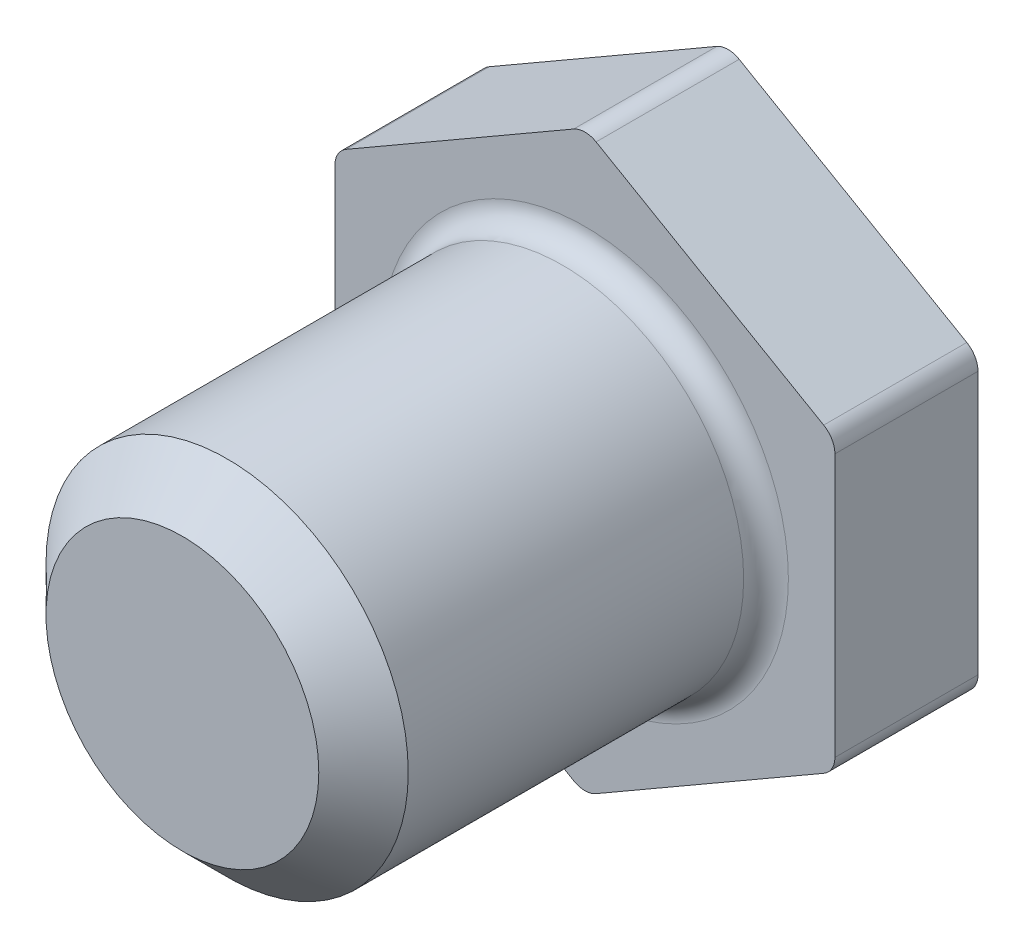
ISO-10303-21;
HEADER;
FILE_DESCRIPTION(('STEP AP214'),'2;1');
FILE_NAME('part.step','',(''),(''),'','','');
FILE_SCHEMA(('AUTOMOTIVE_DESIGN { 1 0 10303 214 1 1 1 1 }'));
ENDSEC;
DATA;
#1=APPLICATION_CONTEXT('core data for automotive mechanical design processes');
#2=APPLICATION_PROTOCOL_DEFINITION('international standard','automotive_design',2000,#1);
#3=PRODUCT_CONTEXT('',#1,'mechanical');
#4=PRODUCT('Part','Part','',(#3));
#5=PRODUCT_RELATED_PRODUCT_CATEGORY('part','',(#4));
#6=PRODUCT_DEFINITION_FORMATION('','',#4);
#7=PRODUCT_DEFINITION_CONTEXT('part definition',#1,'design');
#8=PRODUCT_DEFINITION('design','',#6,#7);
#9=PRODUCT_DEFINITION_SHAPE('','',#8);
#10=(LENGTH_UNIT() NAMED_UNIT(*) SI_UNIT(.MILLI.,.METRE.));
#11=(NAMED_UNIT(*) PLANE_ANGLE_UNIT() SI_UNIT($,.RADIAN.));
#12=(NAMED_UNIT(*) SI_UNIT($,.STERADIAN.) SOLID_ANGLE_UNIT());
#13=UNCERTAINTY_MEASURE_WITH_UNIT(LENGTH_MEASURE(1.E-05),#10,'distance_accuracy_value','');
#14=(GEOMETRIC_REPRESENTATION_CONTEXT(3) GLOBAL_UNCERTAINTY_ASSIGNED_CONTEXT((#13)) GLOBAL_UNIT_ASSIGNED_CONTEXT((#10,
#11,#12)) REPRESENTATION_CONTEXT('',''));
#15=CARTESIAN_POINT('',(0.,0.,0.));
#16=DIRECTION('',(0.,0.,1.));
#17=DIRECTION('',(1.,0.,0.));
#18=AXIS2_PLACEMENT_3D('',#15,#16,#17);
#19=CARTESIAN_POINT('',(5.59,-3.22738800477001,3.2));
#20=DIRECTION('',(-1.,0.,0.));
#21=DIRECTION('',(0.,-1.,0.));
#22=AXIS2_PLACEMENT_3D('',#19,#20,#21);
#23=PLANE('',#22);
#24=DIRECTION('',(0.,1.,0.));
#25=VECTOR('',#24,1.);
#26=CARTESIAN_POINT('',(5.59,-3.22738800477001,3.2));
#27=LINE('',#26,#25);
#28=CARTESIAN_POINT('',(5.59,-2.9387128701752,3.2));
#29=VERTEX_POINT('',#28);
#30=CARTESIAN_POINT('',(5.59,2.93871287017519,3.2));
#31=VERTEX_POINT('',#30);
#32=EDGE_CURVE('E145',#29,#31,#27,.T.);
#33=ORIENTED_EDGE('',*,*,#32,.F.);
#34=DIRECTION('',(0.,0.,-1.));
#35=VECTOR('',#34,1.);
#36=CARTESIAN_POINT('',(5.59,-2.9387128701752,3.2));
#37=LINE('',#36,#35);
#38=CARTESIAN_POINT('',(5.59,-2.9387128701752,0.));
#39=VERTEX_POINT('',#38);
#40=EDGE_CURVE('E159',#29,#39,#37,.T.);
#41=ORIENTED_EDGE('',*,*,#40,.T.);
#42=DIRECTION('',(0.,1.,0.));
#43=VECTOR('',#42,1.);
#44=CARTESIAN_POINT('',(5.59,-3.22738800477001,0.));
#45=LINE('',#44,#43);
#46=CARTESIAN_POINT('',(5.59,2.93871287017519,0.));
#47=VERTEX_POINT('',#46);
#48=EDGE_CURVE('E320',#39,#47,#45,.T.);
#49=ORIENTED_EDGE('',*,*,#48,.T.);
#50=DIRECTION('',(0.,0.,-1.));
#51=VECTOR('',#50,1.);
#52=CARTESIAN_POINT('',(5.59,2.93871287017519,3.2));
#53=LINE('',#52,#51);
#54=EDGE_CURVE('E161',#47,#31,#53,.F.);
#55=ORIENTED_EDGE('',*,*,#54,.T.);
#56=EDGE_LOOP('',(#33,#41,#49,#55));
#57=FACE_BOUND('',#56,.T.);
#58=ADVANCED_FACE('F47',(#57),#23,.F.);
#59=CARTESIAN_POINT('',(5.59,3.22738800477001,3.2));
#60=DIRECTION('',(-0.5,-0.866025403784439,0.));
#61=DIRECTION('',(0.866025403784439,-0.5,0.));
#62=AXIS2_PLACEMENT_3D('',#59,#60,#61);
#63=PLANE('',#62);
#64=DIRECTION('',(-0.866025403784439,0.5,0.));
#65=VECTOR('',#64,1.);
#66=CARTESIAN_POINT('',(5.59,3.22738800477001,3.2));
#67=LINE('',#66,#65);
#68=CARTESIAN_POINT('',(5.34,3.37172557206741,3.2));
#69=VERTEX_POINT('',#68);
#70=CARTESIAN_POINT('',(0.249999999999999,6.31043844224261,3.2));
#71=VERTEX_POINT('',#70);
#72=EDGE_CURVE('E163',#69,#71,#67,.T.);
#73=ORIENTED_EDGE('',*,*,#72,.F.);
#74=DIRECTION('',(0.,0.,-1.));
#75=VECTOR('',#74,1.);
#76=CARTESIAN_POINT('',(5.34,3.37172557206741,3.2));
#77=LINE('',#76,#75);
#78=CARTESIAN_POINT('',(5.34,3.37172557206741,0.));
#79=VERTEX_POINT('',#78);
#80=EDGE_CURVE('E173',#69,#79,#77,.T.);
#81=ORIENTED_EDGE('',*,*,#80,.T.);
#82=DIRECTION('',(-0.866025403784439,0.5,0.));
#83=VECTOR('',#82,1.);
#84=CARTESIAN_POINT('',(5.59,3.22738800477001,0.));
#85=LINE('',#84,#83);
#86=CARTESIAN_POINT('',(0.249999999999999,6.31043844224261,0.));
#87=VERTEX_POINT('',#86);
#88=EDGE_CURVE('E323',#79,#87,#85,.T.);
#89=ORIENTED_EDGE('',*,*,#88,.T.);
#90=DIRECTION('',(0.,0.,-1.));
#91=VECTOR('',#90,1.);
#92=CARTESIAN_POINT('',(0.25,6.31043844224261,3.2));
#93=LINE('',#92,#91);
#94=EDGE_CURVE('E169',#87,#71,#93,.F.);
#95=ORIENTED_EDGE('',*,*,#94,.T.);
#96=EDGE_LOOP('',(#73,#81,#89,#95));
#97=FACE_BOUND('',#96,.T.);
#98=ADVANCED_FACE('F197',(#97),#63,.F.);
#99=CARTESIAN_POINT('',(0.,6.45477600954001,3.2));
#100=DIRECTION('',(0.499999999999999,-0.866025403784439,0.));
#101=DIRECTION('',(0.866025403784439,0.499999999999999,0.));
#102=AXIS2_PLACEMENT_3D('',#99,#100,#101);
#103=PLANE('',#102);
#104=DIRECTION('',(-0.866025403784439,-0.499999999999999,0.));
#105=VECTOR('',#104,1.);
#106=CARTESIAN_POINT('',(0.,6.45477600954001,0.));
#107=LINE('',#106,#105);
#108=CARTESIAN_POINT('',(-0.25,6.31043844224261,0.));
#109=VERTEX_POINT('',#108);
#110=CARTESIAN_POINT('',(-5.34,3.37172557206742,0.));
#111=VERTEX_POINT('',#110);
#112=EDGE_CURVE('E326',#109,#111,#107,.T.);
#113=ORIENTED_EDGE('',*,*,#112,.T.);
#114=DIRECTION('',(0.,0.,-1.));
#115=VECTOR('',#114,1.);
#116=CARTESIAN_POINT('',(-5.34,3.37172557206742,3.2));
#117=LINE('',#116,#115);
#118=CARTESIAN_POINT('',(-5.34,3.37172557206742,3.2));
#119=VERTEX_POINT('',#118);
#120=EDGE_CURVE('E276',#111,#119,#117,.F.);
#121=ORIENTED_EDGE('',*,*,#120,.T.);
#122=DIRECTION('',(-0.866025403784439,-0.499999999999999,0.));
#123=VECTOR('',#122,1.);
#124=CARTESIAN_POINT('',(0.,6.45477600954001,3.2));
#125=LINE('',#124,#123);
#126=CARTESIAN_POINT('',(-0.25,6.31043844224261,3.2));
#127=VERTEX_POINT('',#126);
#128=EDGE_CURVE('E360',#127,#119,#125,.T.);
#129=ORIENTED_EDGE('',*,*,#128,.F.);
#130=DIRECTION('',(0.,0.,-1.));
#131=VECTOR('',#130,1.);
#132=CARTESIAN_POINT('',(-0.25,6.31043844224261,3.2));
#133=LINE('',#132,#131);
#134=EDGE_CURVE('E272',#127,#109,#133,.T.);
#135=ORIENTED_EDGE('',*,*,#134,.T.);
#136=EDGE_LOOP('',(#113,#121,#129,#135));
#137=FACE_BOUND('',#136,.T.);
#138=ADVANCED_FACE('F202',(#137),#103,.F.);
#139=CARTESIAN_POINT('',(-5.59,3.22738800477001,3.2));
#140=DIRECTION('',(1.,0.,0.));
#141=DIRECTION('',(0.,1.,0.));
#142=AXIS2_PLACEMENT_3D('',#139,#140,#141);
#143=PLANE('',#142);
#144=DIRECTION('',(0.,-1.,0.));
#145=VECTOR('',#144,1.);
#146=CARTESIAN_POINT('',(-5.59,3.22738800477001,3.2));
#147=LINE('',#146,#145);
#148=CARTESIAN_POINT('',(-5.59,2.9387128701752,3.2));
#149=VERTEX_POINT('',#148);
#150=CARTESIAN_POINT('',(-5.59,-2.9387128701752,3.2));
#151=VERTEX_POINT('',#150);
#152=EDGE_CURVE('E316',#149,#151,#147,.T.);
#153=ORIENTED_EDGE('',*,*,#152,.F.);
#154=DIRECTION('',(0.,0.,-1.));
#155=VECTOR('',#154,1.);
#156=CARTESIAN_POINT('',(-5.59,2.9387128701752,3.2));
#157=LINE('',#156,#155);
#158=CARTESIAN_POINT('',(-5.59,2.9387128701752,0.));
#159=VERTEX_POINT('',#158);
#160=EDGE_CURVE('E253',#149,#159,#157,.T.);
#161=ORIENTED_EDGE('',*,*,#160,.T.);
#162=DIRECTION('',(0.,-1.,0.));
#163=VECTOR('',#162,1.);
#164=CARTESIAN_POINT('',(-5.59,3.22738800477001,0.));
#165=LINE('',#164,#163);
#166=CARTESIAN_POINT('',(-5.59,-2.9387128701752,0.));
#167=VERTEX_POINT('',#166);
#168=EDGE_CURVE('E304',#159,#167,#165,.T.);
#169=ORIENTED_EDGE('',*,*,#168,.T.);
#170=DIRECTION('',(0.,0.,-1.));
#171=VECTOR('',#170,1.);
#172=CARTESIAN_POINT('',(-5.59,-2.9387128701752,3.2));
#173=LINE('',#172,#171);
#174=EDGE_CURVE('E250',#167,#151,#173,.F.);
#175=ORIENTED_EDGE('',*,*,#174,.T.);
#176=EDGE_LOOP('',(#153,#161,#169,#175));
#177=FACE_BOUND('',#176,.T.);
#178=ADVANCED_FACE('F334',(#177),#143,.F.);
#179=CARTESIAN_POINT('',(-5.59,-3.22738800477001,3.2));
#180=DIRECTION('',(0.5,0.866025403784439,0.));
#181=DIRECTION('',(-0.866025403784439,0.5,0.));
#182=AXIS2_PLACEMENT_3D('',#179,#180,#181);
#183=PLANE('',#182);
#184=DIRECTION('',(0.866025403784439,-0.5,0.));
#185=VECTOR('',#184,1.);
#186=CARTESIAN_POINT('',(-5.59,-3.22738800477001,3.2));
#187=LINE('',#186,#185);
#188=CARTESIAN_POINT('',(-5.34,-3.37172557206741,3.2));
#189=VERTEX_POINT('',#188);
#190=CARTESIAN_POINT('',(-0.250000000000003,-6.31043844224261,3.2));
#191=VERTEX_POINT('',#190);
#192=EDGE_CURVE('E312',#189,#191,#187,.T.);
#193=ORIENTED_EDGE('',*,*,#192,.F.);
#194=DIRECTION('',(0.,0.,-1.));
#195=VECTOR('',#194,1.);
#196=CARTESIAN_POINT('',(-5.34,-3.37172557206741,3.2));
#197=LINE('',#196,#195);
#198=CARTESIAN_POINT('',(-5.34,-3.37172557206741,0.));
#199=VERTEX_POINT('',#198);
#200=EDGE_CURVE('E282',#189,#199,#197,.T.);
#201=ORIENTED_EDGE('',*,*,#200,.T.);
#202=DIRECTION('',(0.866025403784439,-0.5,0.));
#203=VECTOR('',#202,1.);
#204=CARTESIAN_POINT('',(-5.59,-3.22738800477001,0.));
#205=LINE('',#204,#203);
#206=CARTESIAN_POINT('',(-0.250000000000003,-6.31043844224261,0.));
#207=VERTEX_POINT('',#206);
#208=EDGE_CURVE('E301',#199,#207,#205,.T.);
#209=ORIENTED_EDGE('',*,*,#208,.T.);
#210=DIRECTION('',(0.,0.,-1.));
#211=VECTOR('',#210,1.);
#212=CARTESIAN_POINT('',(-0.250000000000003,-6.31043844224261,3.2));
#213=LINE('',#212,#211);
#214=EDGE_CURVE('E279',#207,#191,#213,.F.);
#215=ORIENTED_EDGE('',*,*,#214,.T.);
#216=EDGE_LOOP('',(#193,#201,#209,#215));
#217=FACE_BOUND('',#216,.T.);
#218=ADVANCED_FACE('F341',(#217),#183,.F.);
#219=CARTESIAN_POINT('',(0.,-6.45477600954001,3.2));
#220=DIRECTION('',(-0.499999999999999,0.866025403784439,0.));
#221=DIRECTION('',(-0.866025403784439,-0.499999999999999,0.));
#222=AXIS2_PLACEMENT_3D('',#219,#220,#221);
#223=PLANE('',#222);
#224=DIRECTION('',(0.866025403784439,0.499999999999999,0.));
#225=VECTOR('',#224,1.);
#226=CARTESIAN_POINT('',(0.,-6.45477600954001,3.2));
#227=LINE('',#226,#225);
#228=CARTESIAN_POINT('',(0.249999999999996,-6.31043844224261,3.2));
#229=VERTEX_POINT('',#228);
#230=CARTESIAN_POINT('',(5.34,-3.37172557206742,3.2));
#231=VERTEX_POINT('',#230);
#232=EDGE_CURVE('E148',#229,#231,#227,.T.);
#233=ORIENTED_EDGE('',*,*,#232,.F.);
#234=DIRECTION('',(0.,0.,-1.));
#235=VECTOR('',#234,1.);
#236=CARTESIAN_POINT('',(0.249999999999996,-6.31043844224261,3.2));
#237=LINE('',#236,#235);
#238=CARTESIAN_POINT('',(0.249999999999996,-6.31043844224261,0.));
#239=VERTEX_POINT('',#238);
#240=EDGE_CURVE('E175',#229,#239,#237,.T.);
#241=ORIENTED_EDGE('',*,*,#240,.T.);
#242=DIRECTION('',(0.866025403784439,0.499999999999999,0.));
#243=VECTOR('',#242,1.);
#244=CARTESIAN_POINT('',(0.,-6.45477600954001,0.));
#245=LINE('',#244,#243);
#246=CARTESIAN_POINT('',(5.34,-3.37172557206742,0.));
#247=VERTEX_POINT('',#246);
#248=EDGE_CURVE('E164',#239,#247,#245,.T.);
#249=ORIENTED_EDGE('',*,*,#248,.T.);
#250=DIRECTION('',(0.,0.,-1.));
#251=VECTOR('',#250,1.);
#252=CARTESIAN_POINT('',(5.34,-3.37172557206742,3.2));
#253=LINE('',#252,#251);
#254=EDGE_CURVE('E286',#247,#231,#253,.F.);
#255=ORIENTED_EDGE('',*,*,#254,.T.);
#256=EDGE_LOOP('',(#233,#241,#249,#255));
#257=FACE_BOUND('',#256,.T.);
#258=ADVANCED_FACE('F294',(#257),#223,.F.);
#259=CARTESIAN_POINT('',(0.,0.,3.2));
#260=DIRECTION('',(0.,0.,1.));
#261=DIRECTION('',(1.,0.,0.));
#262=AXIS2_PLACEMENT_3D('',#259,#260,#261);
#263=PLANE('',#262);
#264=CARTESIAN_POINT('',(0.,0.,3.2));
#265=DIRECTION('',(0.,0.,1.));
#266=DIRECTION('',(1.,0.,0.));
#267=AXIS2_PLACEMENT_3D('',#264,#265,#266);
#268=CIRCLE('',#267,4.55);
#269=CARTESIAN_POINT('',(4.55,0.,3.2));
#270=VERTEX_POINT('',#269);
#271=EDGE_CURVE('E246',#270,#270,#268,.F.);
#272=ORIENTED_EDGE('',*,*,#271,.T.);
#273=EDGE_LOOP('',(#272));
#274=FACE_BOUND('',#273,.T.);
#275=ORIENTED_EDGE('',*,*,#128,.T.);
#276=CARTESIAN_POINT('',(-5.09,2.9387128701752,3.2));
#277=DIRECTION('',(0.,0.,1.));
#278=DIRECTION('',(1.,0.,0.));
#279=AXIS2_PLACEMENT_3D('',#276,#277,#278);
#280=CIRCLE('',#279,0.5);
#281=EDGE_CURVE('E243',#119,#149,#280,.T.);
#282=ORIENTED_EDGE('',*,*,#281,.T.);
#283=ORIENTED_EDGE('',*,*,#152,.T.);
#284=CARTESIAN_POINT('',(-5.09,-2.9387128701752,3.2));
#285=DIRECTION('',(0.,0.,1.));
#286=DIRECTION('',(1.,0.,0.));
#287=AXIS2_PLACEMENT_3D('',#284,#285,#286);
#288=CIRCLE('',#287,0.5);
#289=EDGE_CURVE('E240',#151,#189,#288,.T.);
#290=ORIENTED_EDGE('',*,*,#289,.T.);
#291=ORIENTED_EDGE('',*,*,#192,.T.);
#292=CARTESIAN_POINT('',(0.,-5.87742574035039,3.2));
#293=DIRECTION('',(0.,0.,1.));
#294=DIRECTION('',(1.,0.,0.));
#295=AXIS2_PLACEMENT_3D('',#292,#293,#294);
#296=CIRCLE('',#295,0.5);
#297=EDGE_CURVE('E153',#191,#229,#296,.T.);
#298=ORIENTED_EDGE('',*,*,#297,.T.);
#299=ORIENTED_EDGE('',*,*,#232,.T.);
#300=CARTESIAN_POINT('',(5.09,-2.9387128701752,3.2));
#301=DIRECTION('',(0.,0.,1.));
#302=DIRECTION('',(1.,0.,0.));
#303=AXIS2_PLACEMENT_3D('',#300,#301,#302);
#304=CIRCLE('',#303,0.5);
#305=EDGE_CURVE('E141',#231,#29,#304,.T.);
#306=ORIENTED_EDGE('',*,*,#305,.T.);
#307=ORIENTED_EDGE('',*,*,#32,.T.);
#308=CARTESIAN_POINT('',(5.09,2.93871287017519,3.2));
#309=DIRECTION('',(0.,0.,1.));
#310=DIRECTION('',(1.,0.,0.));
#311=AXIS2_PLACEMENT_3D('',#308,#309,#310);
#312=CIRCLE('',#311,0.5);
#313=EDGE_CURVE('E154',#31,#69,#312,.T.);
#314=ORIENTED_EDGE('',*,*,#313,.T.);
#315=ORIENTED_EDGE('',*,*,#72,.T.);
#316=CARTESIAN_POINT('',(0.,5.87742574035039,3.2));
#317=DIRECTION('',(0.,0.,1.));
#318=DIRECTION('',(1.,0.,0.));
#319=AXIS2_PLACEMENT_3D('',#316,#317,#318);
#320=CIRCLE('',#319,0.5);
#321=EDGE_CURVE('E231',#71,#127,#320,.T.);
#322=ORIENTED_EDGE('',*,*,#321,.T.);
#323=EDGE_LOOP('',(#275,#282,#283,#290,#291,#298,#299,#306,#307,#314,#315,#322));
#324=FACE_BOUND('',#323,.T.);
#325=ADVANCED_FACE('F144',(#274,#324),#263,.T.);
#326=CARTESIAN_POINT('',(0.,0.,0.));
#327=DIRECTION('',(0.,0.,1.));
#328=DIRECTION('',(1.,0.,0.));
#329=AXIS2_PLACEMENT_3D('',#326,#327,#328);
#330=PLANE('',#329);
#331=ORIENTED_EDGE('',*,*,#168,.F.);
#332=CARTESIAN_POINT('',(-5.09,2.9387128701752,0.));
#333=DIRECTION('',(0.,0.,1.));
#334=DIRECTION('',(1.,0.,0.));
#335=AXIS2_PLACEMENT_3D('',#332,#333,#334);
#336=CIRCLE('',#335,0.5);
#337=EDGE_CURVE('E269',#159,#111,#336,.F.);
#338=ORIENTED_EDGE('',*,*,#337,.T.);
#339=ORIENTED_EDGE('',*,*,#112,.F.);
#340=CARTESIAN_POINT('',(0.,5.87742574035039,0.));
#341=DIRECTION('',(0.,0.,1.));
#342=DIRECTION('',(1.,0.,0.));
#343=AXIS2_PLACEMENT_3D('',#340,#341,#342);
#344=CIRCLE('',#343,0.5);
#345=EDGE_CURVE('E64',#109,#87,#344,.F.);
#346=ORIENTED_EDGE('',*,*,#345,.T.);
#347=ORIENTED_EDGE('',*,*,#88,.F.);
#348=CARTESIAN_POINT('',(5.09,2.93871287017519,0.));
#349=DIRECTION('',(0.,0.,1.));
#350=DIRECTION('',(1.,0.,0.));
#351=AXIS2_PLACEMENT_3D('',#348,#349,#350);
#352=CIRCLE('',#351,0.5);
#353=EDGE_CURVE('E72',#79,#47,#352,.F.);
#354=ORIENTED_EDGE('',*,*,#353,.T.);
#355=ORIENTED_EDGE('',*,*,#48,.F.);
#356=CARTESIAN_POINT('',(5.09,-2.9387128701752,0.));
#357=DIRECTION('',(0.,0.,1.));
#358=DIRECTION('',(1.,0.,0.));
#359=AXIS2_PLACEMENT_3D('',#356,#357,#358);
#360=CIRCLE('',#359,0.5);
#361=EDGE_CURVE('E167',#39,#247,#360,.F.);
#362=ORIENTED_EDGE('',*,*,#361,.T.);
#363=ORIENTED_EDGE('',*,*,#248,.F.);
#364=CARTESIAN_POINT('',(0.,-5.87742574035039,0.));
#365=DIRECTION('',(0.,0.,1.));
#366=DIRECTION('',(1.,0.,0.));
#367=AXIS2_PLACEMENT_3D('',#364,#365,#366);
#368=CIRCLE('',#367,0.5);
#369=EDGE_CURVE('E263',#239,#207,#368,.F.);
#370=ORIENTED_EDGE('',*,*,#369,.T.);
#371=ORIENTED_EDGE('',*,*,#208,.F.);
#372=CARTESIAN_POINT('',(-5.09,-2.9387128701752,0.));
#373=DIRECTION('',(0.,0.,1.));
#374=DIRECTION('',(1.,0.,0.));
#375=AXIS2_PLACEMENT_3D('',#372,#373,#374);
#376=CIRCLE('',#375,0.5);
#377=EDGE_CURVE('E266',#199,#167,#376,.F.);
#378=ORIENTED_EDGE('',*,*,#377,.T.);
#379=EDGE_LOOP('',(#331,#338,#339,#346,#347,#354,#355,#362,#363,#370,#371,#378));
#380=FACE_BOUND('',#379,.T.);
#381=ADVANCED_FACE('F297',(#380),#330,.F.);
#382=CARTESIAN_POINT('',(0.,0.,12.2));
#383=DIRECTION('',(0.,0.,-1.));
#384=DIRECTION('',(-1.,0.,0.));
#385=AXIS2_PLACEMENT_3D('',#382,#383,#384);
#386=CYLINDRICAL_SURFACE('',#385,4.05);
#387=CARTESIAN_POINT('',(0.,0.,11.2));
#388=DIRECTION('',(0.,0.,1.));
#389=DIRECTION('',(1.,0.,0.));
#390=AXIS2_PLACEMENT_3D('',#387,#388,#389);
#391=CIRCLE('',#390,4.05);
#392=CARTESIAN_POINT('',(4.05,0.,11.2));
#393=VERTEX_POINT('',#392);
#394=EDGE_CURVE('E11',#393,#393,#391,.F.);
#395=ORIENTED_EDGE('',*,*,#394,.T.);
#396=EDGE_LOOP('',(#395));
#397=FACE_BOUND('',#396,.T.);
#398=CARTESIAN_POINT('',(0.,0.,3.7));
#399=DIRECTION('',(0.,0.,1.));
#400=DIRECTION('',(1.,0.,0.));
#401=AXIS2_PLACEMENT_3D('',#398,#399,#400);
#402=CIRCLE('',#401,4.05);
#403=CARTESIAN_POINT('',(4.05,0.,3.7));
#404=VERTEX_POINT('',#403);
#405=EDGE_CURVE('E234',#404,#404,#402,.T.);
#406=ORIENTED_EDGE('',*,*,#405,.T.);
#407=EDGE_LOOP('',(#406));
#408=FACE_BOUND('',#407,.T.);
#409=ADVANCED_FACE('F404',(#397,#408),#386,.T.);
#410=CARTESIAN_POINT('',(0.,0.,12.2));
#411=DIRECTION('',(0.,0.,1.));
#412=DIRECTION('',(1.,0.,0.));
#413=AXIS2_PLACEMENT_3D('',#410,#411,#412);
#414=PLANE('',#413);
#415=CARTESIAN_POINT('',(0.,0.,12.2));
#416=DIRECTION('',(0.,0.,1.));
#417=DIRECTION('',(1.,0.,0.));
#418=AXIS2_PLACEMENT_3D('',#415,#416,#417);
#419=CIRCLE('',#418,3.05);
#420=CARTESIAN_POINT('',(3.05,0.,12.2));
#421=VERTEX_POINT('',#420);
#422=EDGE_CURVE('E57',#421,#421,#419,.T.);
#423=ORIENTED_EDGE('',*,*,#422,.T.);
#424=EDGE_LOOP('',(#423));
#425=FACE_BOUND('',#424,.T.);
#426=ADVANCED_FACE('F184',(#425),#414,.T.);
#427=CARTESIAN_POINT('',(0.,0.,3.7));
#428=DIRECTION('',(0.,0.,1.));
#429=DIRECTION('',(1.,0.,0.));
#430=AXIS2_PLACEMENT_3D('',#427,#428,#429);
#431=TOROIDAL_SURFACE('',#430,4.55,0.5);
#432=ORIENTED_EDGE('',*,*,#271,.F.);
#433=EDGE_LOOP('',(#432));
#434=FACE_BOUND('',#433,.T.);
#435=ORIENTED_EDGE('',*,*,#405,.F.);
#436=EDGE_LOOP('',(#435));
#437=FACE_BOUND('',#436,.T.);
#438=ADVANCED_FACE('F207',(#434,#437),#431,.F.);
#439=CARTESIAN_POINT('',(-5.09,2.9387128701752,3.2));
#440=DIRECTION('',(0.,0.,-1.));
#441=DIRECTION('',(-1.,0.,0.));
#442=AXIS2_PLACEMENT_3D('',#439,#440,#441);
#443=CYLINDRICAL_SURFACE('',#442,0.5);
#444=ORIENTED_EDGE('',*,*,#281,.F.);
#445=ORIENTED_EDGE('',*,*,#120,.F.);
#446=ORIENTED_EDGE('',*,*,#337,.F.);
#447=ORIENTED_EDGE('',*,*,#160,.F.);
#448=EDGE_LOOP('',(#444,#445,#446,#447));
#449=FACE_BOUND('',#448,.T.);
#450=ADVANCED_FACE('F210',(#449),#443,.T.);
#451=CARTESIAN_POINT('',(-5.09,-2.9387128701752,3.2));
#452=DIRECTION('',(0.,0.,-1.));
#453=DIRECTION('',(-1.,0.,0.));
#454=AXIS2_PLACEMENT_3D('',#451,#452,#453);
#455=CYLINDRICAL_SURFACE('',#454,0.5);
#456=ORIENTED_EDGE('',*,*,#289,.F.);
#457=ORIENTED_EDGE('',*,*,#174,.F.);
#458=ORIENTED_EDGE('',*,*,#377,.F.);
#459=ORIENTED_EDGE('',*,*,#200,.F.);
#460=EDGE_LOOP('',(#456,#457,#458,#459));
#461=FACE_BOUND('',#460,.T.);
#462=ADVANCED_FACE('F214',(#461),#455,.T.);
#463=CARTESIAN_POINT('',(0.,-5.87742574035039,3.2));
#464=DIRECTION('',(0.,0.,-1.));
#465=DIRECTION('',(-1.,0.,0.));
#466=AXIS2_PLACEMENT_3D('',#463,#464,#465);
#467=CYLINDRICAL_SURFACE('',#466,0.5);
#468=ORIENTED_EDGE('',*,*,#297,.F.);
#469=ORIENTED_EDGE('',*,*,#214,.F.);
#470=ORIENTED_EDGE('',*,*,#369,.F.);
#471=ORIENTED_EDGE('',*,*,#240,.F.);
#472=EDGE_LOOP('',(#468,#469,#470,#471));
#473=FACE_BOUND('',#472,.T.);
#474=ADVANCED_FACE('F218',(#473),#467,.T.);
#475=CARTESIAN_POINT('',(5.09,-2.9387128701752,3.2));
#476=DIRECTION('',(0.,0.,-1.));
#477=DIRECTION('',(-1.,0.,0.));
#478=AXIS2_PLACEMENT_3D('',#475,#476,#477);
#479=CYLINDRICAL_SURFACE('',#478,0.5);
#480=ORIENTED_EDGE('',*,*,#305,.F.);
#481=ORIENTED_EDGE('',*,*,#254,.F.);
#482=ORIENTED_EDGE('',*,*,#361,.F.);
#483=ORIENTED_EDGE('',*,*,#40,.F.);
#484=EDGE_LOOP('',(#480,#481,#482,#483));
#485=FACE_BOUND('',#484,.T.);
#486=ADVANCED_FACE('F166',(#485),#479,.T.);
#487=CARTESIAN_POINT('',(5.09,2.93871287017519,3.2));
#488=DIRECTION('',(0.,0.,-1.));
#489=DIRECTION('',(-1.,0.,0.));
#490=AXIS2_PLACEMENT_3D('',#487,#488,#489);
#491=CYLINDRICAL_SURFACE('',#490,0.5);
#492=ORIENTED_EDGE('',*,*,#313,.F.);
#493=ORIENTED_EDGE('',*,*,#54,.F.);
#494=ORIENTED_EDGE('',*,*,#353,.F.);
#495=ORIENTED_EDGE('',*,*,#80,.F.);
#496=EDGE_LOOP('',(#492,#493,#494,#495));
#497=FACE_BOUND('',#496,.T.);
#498=ADVANCED_FACE('F193',(#497),#491,.T.);
#499=CARTESIAN_POINT('',(0.,5.87742574035039,3.2));
#500=DIRECTION('',(0.,0.,-1.));
#501=DIRECTION('',(-1.,0.,0.));
#502=AXIS2_PLACEMENT_3D('',#499,#500,#501);
#503=CYLINDRICAL_SURFACE('',#502,0.5);
#504=ORIENTED_EDGE('',*,*,#321,.F.);
#505=ORIENTED_EDGE('',*,*,#94,.F.);
#506=ORIENTED_EDGE('',*,*,#345,.F.);
#507=ORIENTED_EDGE('',*,*,#134,.F.);
#508=EDGE_LOOP('',(#504,#505,#506,#507));
#509=FACE_BOUND('',#508,.T.);
#510=ADVANCED_FACE('F187',(#509),#503,.T.);
#511=CARTESIAN_POINT('',(0.,0.,12.2));
#512=DIRECTION('',(0.,0.,-1.));
#513=DIRECTION('',(-1.,0.,0.));
#514=AXIS2_PLACEMENT_3D('',#511,#512,#513);
#515=CONICAL_SURFACE('',#514,3.05,0.785398163397447);
#516=ORIENTED_EDGE('',*,*,#394,.F.);
#517=EDGE_LOOP('',(#516));
#518=FACE_BOUND('',#517,.T.);
#519=ORIENTED_EDGE('',*,*,#422,.F.);
#520=EDGE_LOOP('',(#519));
#521=FACE_BOUND('',#520,.T.);
#522=ADVANCED_FACE('F50',(#518,#521),#515,.T.);
#523=CLOSED_SHELL('',(#58,#98,#138,#178,#218,#258,#325,#381,#409,#426,#438,#450,#462,#474,#486,
#498,#510,#522));
#524=MANIFOLD_SOLID_BREP('B2',#523);
#525=ADVANCED_BREP_SHAPE_REPRESENTATION('',(#18,#524),#14);
#526=SHAPE_DEFINITION_REPRESENTATION(#9,#525);
ENDSEC;
END-ISO-10303-21;
